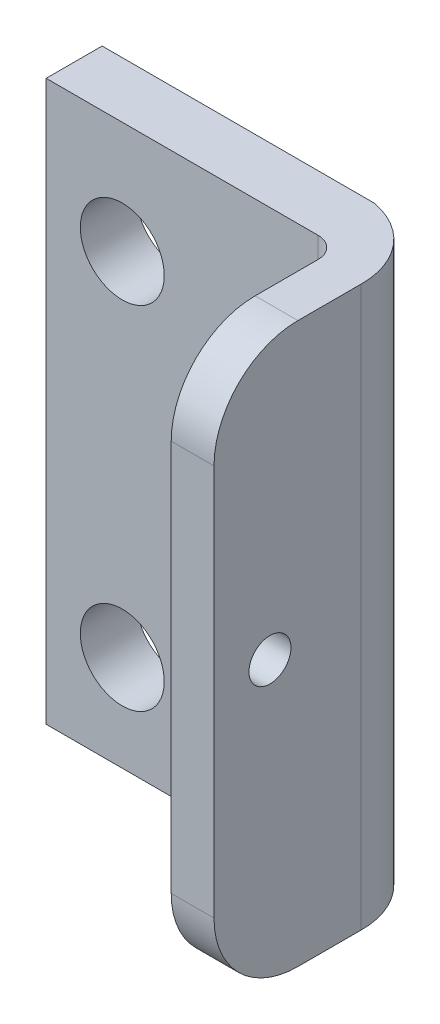
ISO-10303-21;
HEADER;
FILE_DESCRIPTION(('STEP AP214'),'2;1');
FILE_NAME('part.step','',(''),(''),'','','');
FILE_SCHEMA(('AUTOMOTIVE_DESIGN { 1 0 10303 214 1 1 1 1 }'));
ENDSEC;
DATA;
#1=APPLICATION_CONTEXT('core data for automotive mechanical design processes');
#2=APPLICATION_PROTOCOL_DEFINITION('international standard','automotive_design',2000,#1);
#3=PRODUCT_CONTEXT('',#1,'mechanical');
#4=PRODUCT('Part','Part','',(#3));
#5=PRODUCT_RELATED_PRODUCT_CATEGORY('part','',(#4));
#6=PRODUCT_DEFINITION_FORMATION('','',#4);
#7=PRODUCT_DEFINITION_CONTEXT('part definition',#1,'design');
#8=PRODUCT_DEFINITION('design','',#6,#7);
#9=PRODUCT_DEFINITION_SHAPE('','',#8);
#10=(LENGTH_UNIT() NAMED_UNIT(*) SI_UNIT(.MILLI.,.METRE.));
#11=(NAMED_UNIT(*) PLANE_ANGLE_UNIT() SI_UNIT($,.RADIAN.));
#12=(NAMED_UNIT(*) SI_UNIT($,.STERADIAN.) SOLID_ANGLE_UNIT());
#13=UNCERTAINTY_MEASURE_WITH_UNIT(LENGTH_MEASURE(1.E-05),#10,'distance_accuracy_value','');
#14=(GEOMETRIC_REPRESENTATION_CONTEXT(3) GLOBAL_UNCERTAINTY_ASSIGNED_CONTEXT((#13)) GLOBAL_UNIT_ASSIGNED_CONTEXT((#10,
#11,#12)) REPRESENTATION_CONTEXT('',''));
#15=CARTESIAN_POINT('',(0.,0.,0.));
#16=DIRECTION('',(0.,0.,1.));
#17=DIRECTION('',(1.,0.,0.));
#18=AXIS2_PLACEMENT_3D('',#15,#16,#17);
#19=CARTESIAN_POINT('',(0.,0.,2.));
#20=DIRECTION('',(0.,0.,-1.));
#21=DIRECTION('',(-1.,0.,0.));
#22=AXIS2_PLACEMENT_3D('',#19,#20,#21);
#23=PLANE('',#22);
#24=DIRECTION('',(0.,-1.,0.));
#25=VECTOR('',#24,1.);
#26=CARTESIAN_POINT('',(0.,0.,2.));
#27=LINE('',#26,#25);
#28=CARTESIAN_POINT('',(0.,20.,2.));
#29=VERTEX_POINT('',#28);
#30=CARTESIAN_POINT('',(0.,0.,2.));
#31=VERTEX_POINT('',#30);
#32=EDGE_CURVE('E79',#29,#31,#27,.T.);
#33=ORIENTED_EDGE('',*,*,#32,.T.);
#34=DIRECTION('',(1.,0.,0.));
#35=VECTOR('',#34,1.);
#36=CARTESIAN_POINT('',(0.,0.,2.));
#37=LINE('',#36,#35);
#38=CARTESIAN_POINT('',(9.72,0.,2.));
#39=VERTEX_POINT('',#38);
#40=EDGE_CURVE('E295',#31,#39,#37,.T.);
#41=ORIENTED_EDGE('',*,*,#40,.T.);
#42=DIRECTION('',(0.,1.,0.));
#43=VECTOR('',#42,1.);
#44=CARTESIAN_POINT('',(9.72,0.,2.));
#45=LINE('',#44,#43);
#46=CARTESIAN_POINT('',(9.72,20.,2.));
#47=VERTEX_POINT('',#46);
#48=EDGE_CURVE('E297',#39,#47,#45,.T.);
#49=ORIENTED_EDGE('',*,*,#48,.T.);
#50=DIRECTION('',(-1.,0.,0.));
#51=VECTOR('',#50,1.);
#52=CARTESIAN_POINT('',(0.,20.,2.));
#53=LINE('',#52,#51);
#54=EDGE_CURVE('E54',#47,#29,#53,.T.);
#55=ORIENTED_EDGE('',*,*,#54,.T.);
#56=EDGE_LOOP('',(#33,#41,#49,#55));
#57=FACE_BOUND('',#56,.T.);
#58=CARTESIAN_POINT('',(2.72,16.,2.));
#59=DIRECTION('',(0.,0.,1.));
#60=DIRECTION('',(1.,0.,0.));
#61=AXIS2_PLACEMENT_3D('',#58,#59,#60);
#62=CIRCLE('',#61,1.5);
#63=CARTESIAN_POINT('',(4.22,16.,2.));
#64=VERTEX_POINT('',#63);
#65=EDGE_CURVE('E91',#64,#64,#62,.T.);
#66=ORIENTED_EDGE('',*,*,#65,.F.);
#67=EDGE_LOOP('',(#66));
#68=FACE_BOUND('',#67,.T.);
#69=CARTESIAN_POINT('',(2.72,3.43,2.));
#70=DIRECTION('',(0.,0.,1.));
#71=DIRECTION('',(1.,0.,0.));
#72=AXIS2_PLACEMENT_3D('',#69,#70,#71);
#73=CIRCLE('',#72,1.5);
#74=CARTESIAN_POINT('',(4.22,3.43,2.));
#75=VERTEX_POINT('',#74);
#76=EDGE_CURVE('E287',#75,#75,#73,.T.);
#77=ORIENTED_EDGE('',*,*,#76,.F.);
#78=EDGE_LOOP('',(#77));
#79=FACE_BOUND('',#78,.T.);
#80=ADVANCED_FACE('F35',(#57,#68,#79),#23,.F.);
#81=CARTESIAN_POINT('',(0.,0.,0.));
#82=DIRECTION('',(0.,0.,-1.));
#83=DIRECTION('',(-1.,0.,0.));
#84=AXIS2_PLACEMENT_3D('',#81,#82,#83);
#85=PLANE('',#84);
#86=CARTESIAN_POINT('',(2.72,16.,0.));
#87=DIRECTION('',(0.,0.,1.));
#88=DIRECTION('',(1.,0.,0.));
#89=AXIS2_PLACEMENT_3D('',#86,#87,#88);
#90=CIRCLE('',#89,1.5);
#91=CARTESIAN_POINT('',(4.22,16.,0.));
#92=VERTEX_POINT('',#91);
#93=EDGE_CURVE('E95',#92,#92,#90,.T.);
#94=ORIENTED_EDGE('',*,*,#93,.T.);
#95=EDGE_LOOP('',(#94));
#96=FACE_BOUND('',#95,.T.);
#97=DIRECTION('',(0.,-1.,0.));
#98=VECTOR('',#97,1.);
#99=CARTESIAN_POINT('',(0.,0.,0.));
#100=LINE('',#99,#98);
#101=CARTESIAN_POINT('',(0.,20.,0.));
#102=VERTEX_POINT('',#101);
#103=CARTESIAN_POINT('',(0.,0.,0.));
#104=VERTEX_POINT('',#103);
#105=EDGE_CURVE('E85',#102,#104,#100,.T.);
#106=ORIENTED_EDGE('',*,*,#105,.F.);
#107=DIRECTION('',(-1.,0.,0.));
#108=VECTOR('',#107,1.);
#109=CARTESIAN_POINT('',(0.,20.,0.));
#110=LINE('',#109,#108);
#111=CARTESIAN_POINT('',(9.72,20.,0.));
#112=VERTEX_POINT('',#111);
#113=EDGE_CURVE('E72',#112,#102,#110,.T.);
#114=ORIENTED_EDGE('',*,*,#113,.F.);
#115=DIRECTION('',(0.,1.,0.));
#116=VECTOR('',#115,1.);
#117=CARTESIAN_POINT('',(9.72,20.,0.));
#118=LINE('',#117,#116);
#119=CARTESIAN_POINT('',(9.72,0.,0.));
#120=VERTEX_POINT('',#119);
#121=EDGE_CURVE('E80',#120,#112,#118,.T.);
#122=ORIENTED_EDGE('',*,*,#121,.F.);
#123=DIRECTION('',(1.,0.,0.));
#124=VECTOR('',#123,1.);
#125=CARTESIAN_POINT('',(0.,0.,0.));
#126=LINE('',#125,#124);
#127=EDGE_CURVE('E90',#104,#120,#126,.T.);
#128=ORIENTED_EDGE('',*,*,#127,.F.);
#129=EDGE_LOOP('',(#106,#114,#122,#128));
#130=FACE_BOUND('',#129,.T.);
#131=CARTESIAN_POINT('',(2.72,3.43,0.));
#132=DIRECTION('',(0.,0.,1.));
#133=DIRECTION('',(1.,0.,0.));
#134=AXIS2_PLACEMENT_3D('',#131,#132,#133);
#135=CIRCLE('',#134,1.5);
#136=CARTESIAN_POINT('',(4.22,3.43,0.));
#137=VERTEX_POINT('',#136);
#138=EDGE_CURVE('E286',#137,#137,#135,.T.);
#139=ORIENTED_EDGE('',*,*,#138,.T.);
#140=EDGE_LOOP('',(#139));
#141=FACE_BOUND('',#140,.T.);
#142=ADVANCED_FACE('F87',(#96,#130,#141),#85,.T.);
#143=CARTESIAN_POINT('',(0.,0.,2.));
#144=DIRECTION('',(1.,0.,0.));
#145=DIRECTION('',(0.,0.,-1.));
#146=AXIS2_PLACEMENT_3D('',#143,#144,#145);
#147=PLANE('',#146);
#148=ORIENTED_EDGE('',*,*,#105,.T.);
#149=DIRECTION('',(0.,0.,-1.));
#150=VECTOR('',#149,1.);
#151=CARTESIAN_POINT('',(0.,0.,2.));
#152=LINE('',#151,#150);
#153=EDGE_CURVE('E11',#31,#104,#152,.T.);
#154=ORIENTED_EDGE('',*,*,#153,.F.);
#155=ORIENTED_EDGE('',*,*,#32,.F.);
#156=DIRECTION('',(0.,0.,-1.));
#157=VECTOR('',#156,1.);
#158=CARTESIAN_POINT('',(0.,20.,2.));
#159=LINE('',#158,#157);
#160=EDGE_CURVE('E45',#29,#102,#159,.T.);
#161=ORIENTED_EDGE('',*,*,#160,.T.);
#162=EDGE_LOOP('',(#148,#154,#155,#161));
#163=FACE_BOUND('',#162,.T.);
#164=ADVANCED_FACE('F37',(#163),#147,.F.);
#165=CARTESIAN_POINT('',(0.,0.,2.));
#166=DIRECTION('',(0.,1.,0.));
#167=DIRECTION('',(0.,0.,1.));
#168=AXIS2_PLACEMENT_3D('',#165,#166,#167);
#169=PLANE('',#168);
#170=ORIENTED_EDGE('',*,*,#127,.T.);
#171=CARTESIAN_POINT('',(9.25,0.,2.70953870612693));
#172=DIRECTION('',(0.,-1.,0.));
#173=DIRECTION('',(0.,0.,-1.));
#174=AXIS2_PLACEMENT_3D('',#171,#172,#173);
#175=CIRCLE('',#174,2.75);
#176=CARTESIAN_POINT('',(11.9998511631899,0.,2.75));
#177=VERTEX_POINT('',#176);
#178=EDGE_CURVE('E153',#120,#177,#175,.T.);
#179=ORIENTED_EDGE('',*,*,#178,.T.);
#180=DIRECTION('',(0.,0.,-1.));
#181=VECTOR('',#180,1.);
#182=CARTESIAN_POINT('',(12.,0.,4.99999999999998));
#183=LINE('',#182,#181);
#184=CARTESIAN_POINT('',(12.,0.,4.99999999999998));
#185=VERTEX_POINT('',#184);
#186=EDGE_CURVE('E218',#185,#177,#183,.T.);
#187=ORIENTED_EDGE('',*,*,#186,.F.);
#188=DIRECTION('',(1.,0.,0.));
#189=VECTOR('',#188,1.);
#190=CARTESIAN_POINT('',(10.47,0.,4.99999999999998));
#191=LINE('',#190,#189);
#192=CARTESIAN_POINT('',(10.47,0.,4.99999999999998));
#193=VERTEX_POINT('',#192);
#194=EDGE_CURVE('E239',#193,#185,#191,.T.);
#195=ORIENTED_EDGE('',*,*,#194,.F.);
#196=DIRECTION('',(0.,0.,-1.));
#197=VECTOR('',#196,1.);
#198=CARTESIAN_POINT('',(10.47,0.,4.99999999999998));
#199=LINE('',#198,#197);
#200=CARTESIAN_POINT('',(10.47,0.,2.75));
#201=VERTEX_POINT('',#200);
#202=EDGE_CURVE('E204',#193,#201,#199,.T.);
#203=ORIENTED_EDGE('',*,*,#202,.T.);
#204=CARTESIAN_POINT('',(9.72,0.,2.75));
#205=DIRECTION('',(0.,1.,0.));
#206=DIRECTION('',(0.,0.,-1.));
#207=AXIS2_PLACEMENT_3D('',#204,#205,#206);
#208=CIRCLE('',#207,0.75);
#209=EDGE_CURVE('E241',#201,#39,#208,.T.);
#210=ORIENTED_EDGE('',*,*,#209,.T.);
#211=ORIENTED_EDGE('',*,*,#40,.F.);
#212=ORIENTED_EDGE('',*,*,#153,.T.);
#213=EDGE_LOOP('',(#170,#179,#187,#195,#203,#210,#211,#212));
#214=FACE_BOUND('',#213,.T.);
#215=ADVANCED_FACE('F145',(#214),#169,.F.);
#216=CARTESIAN_POINT('',(0.,20.,2.));
#217=DIRECTION('',(0.,-1.,0.));
#218=DIRECTION('',(0.,0.,-1.));
#219=AXIS2_PLACEMENT_3D('',#216,#217,#218);
#220=PLANE('',#219);
#221=ORIENTED_EDGE('',*,*,#113,.T.);
#222=ORIENTED_EDGE('',*,*,#160,.F.);
#223=ORIENTED_EDGE('',*,*,#54,.F.);
#224=CARTESIAN_POINT('',(9.72,20.,2.75));
#225=DIRECTION('',(0.,1.,0.));
#226=DIRECTION('',(0.,0.,-1.));
#227=AXIS2_PLACEMENT_3D('',#224,#225,#226);
#228=CIRCLE('',#227,0.75);
#229=CARTESIAN_POINT('',(10.47,20.,2.75));
#230=VERTEX_POINT('',#229);
#231=EDGE_CURVE('E217',#230,#47,#228,.T.);
#232=ORIENTED_EDGE('',*,*,#231,.F.);
#233=DIRECTION('',(0.,0.,1.));
#234=VECTOR('',#233,1.);
#235=CARTESIAN_POINT('',(10.47,20.,2.75));
#236=LINE('',#235,#234);
#237=CARTESIAN_POINT('',(10.47,20.,4.99999999999998));
#238=VERTEX_POINT('',#237);
#239=EDGE_CURVE('E211',#230,#238,#236,.T.);
#240=ORIENTED_EDGE('',*,*,#239,.T.);
#241=DIRECTION('',(1.,0.,0.));
#242=VECTOR('',#241,1.);
#243=CARTESIAN_POINT('',(10.47,20.,4.99999999999998));
#244=LINE('',#243,#242);
#245=CARTESIAN_POINT('',(12.,20.,4.99999999999998));
#246=VERTEX_POINT('',#245);
#247=EDGE_CURVE('E196',#238,#246,#244,.T.);
#248=ORIENTED_EDGE('',*,*,#247,.T.);
#249=DIRECTION('',(0.,0.,1.));
#250=VECTOR('',#249,1.);
#251=CARTESIAN_POINT('',(12.,20.,2.75));
#252=LINE('',#251,#250);
#253=CARTESIAN_POINT('',(11.9998511631899,20.,2.75));
#254=VERTEX_POINT('',#253);
#255=EDGE_CURVE('E234',#254,#246,#252,.T.);
#256=ORIENTED_EDGE('',*,*,#255,.F.);
#257=CARTESIAN_POINT('',(9.25,20.,2.70953870612693));
#258=DIRECTION('',(0.,-1.,0.));
#259=DIRECTION('',(0.,0.,-1.));
#260=AXIS2_PLACEMENT_3D('',#257,#258,#259);
#261=CIRCLE('',#260,2.75);
#262=EDGE_CURVE('E69',#112,#254,#261,.T.);
#263=ORIENTED_EDGE('',*,*,#262,.F.);
#264=EDGE_LOOP('',(#221,#222,#223,#232,#240,#248,#256,#263));
#265=FACE_BOUND('',#264,.T.);
#266=ADVANCED_FACE('F74',(#265),#220,.F.);
#267=CARTESIAN_POINT('',(2.72,16.,2.));
#268=DIRECTION('',(0.,0.,-1.));
#269=DIRECTION('',(-1.,0.,0.));
#270=AXIS2_PLACEMENT_3D('',#267,#268,#269);
#271=CYLINDRICAL_SURFACE('',#270,1.5);
#272=ORIENTED_EDGE('',*,*,#65,.T.);
#273=EDGE_LOOP('',(#272));
#274=FACE_BOUND('',#273,.T.);
#275=ORIENTED_EDGE('',*,*,#93,.F.);
#276=EDGE_LOOP('',(#275));
#277=FACE_BOUND('',#276,.T.);
#278=ADVANCED_FACE('F134',(#274,#277),#271,.F.);
#279=CARTESIAN_POINT('',(2.72,3.43,2.));
#280=DIRECTION('',(0.,0.,-1.));
#281=DIRECTION('',(-1.,0.,0.));
#282=AXIS2_PLACEMENT_3D('',#279,#280,#281);
#283=CYLINDRICAL_SURFACE('',#282,1.5);
#284=ORIENTED_EDGE('',*,*,#76,.T.);
#285=EDGE_LOOP('',(#284));
#286=FACE_BOUND('',#285,.T.);
#287=ORIENTED_EDGE('',*,*,#138,.F.);
#288=EDGE_LOOP('',(#287));
#289=FACE_BOUND('',#288,.T.);
#290=ADVANCED_FACE('F130',(#286,#289),#283,.F.);
#291=CARTESIAN_POINT('',(9.72,20.,2.75));
#292=DIRECTION('',(0.,-1.,0.));
#293=DIRECTION('',(0.,0.,-1.));
#294=AXIS2_PLACEMENT_3D('',#291,#292,#293);
#295=CYLINDRICAL_SURFACE('',#294,0.75);
#296=ORIENTED_EDGE('',*,*,#209,.F.);
#297=DIRECTION('',(0.,-1.,0.));
#298=VECTOR('',#297,1.);
#299=CARTESIAN_POINT('',(10.47,20.,2.75));
#300=LINE('',#299,#298);
#301=EDGE_CURVE('E284',#230,#201,#300,.T.);
#302=ORIENTED_EDGE('',*,*,#301,.F.);
#303=ORIENTED_EDGE('',*,*,#231,.T.);
#304=ORIENTED_EDGE('',*,*,#48,.F.);
#305=EDGE_LOOP('',(#296,#302,#303,#304));
#306=FACE_BOUND('',#305,.T.);
#307=ADVANCED_FACE('F125',(#306),#295,.F.);
#308=CARTESIAN_POINT('',(9.25,20.,2.70953870612693));
#309=DIRECTION('',(0.,-1.,0.));
#310=DIRECTION('',(0.,0.,-1.));
#311=AXIS2_PLACEMENT_3D('',#308,#309,#310);
#312=CYLINDRICAL_SURFACE('',#311,2.75);
#313=ORIENTED_EDGE('',*,*,#178,.F.);
#314=ORIENTED_EDGE('',*,*,#121,.T.);
#315=ORIENTED_EDGE('',*,*,#262,.T.);
#316=CARTESIAN_POINT('',(11.9997023263797,20.,2.75));
#317=DIRECTION('',(0.,-1.,0.));
#318=VECTOR('',#317,1.);
#319=LINE('',#316,#318);
#320=EDGE_CURVE('E107',#254,#177,#319,.T.);
#321=ORIENTED_EDGE('',*,*,#320,.T.);
#322=EDGE_LOOP('',(#313,#314,#315,#321));
#323=FACE_BOUND('',#322,.T.);
#324=ADVANCED_FACE('F114',(#323),#312,.T.);
#325=CARTESIAN_POINT('',(10.47,3.,5.));
#326=DIRECTION('',(1.,0.,0.));
#327=DIRECTION('',(0.,0.,-1.));
#328=AXIS2_PLACEMENT_3D('',#325,#326,#327);
#329=CYLINDRICAL_SURFACE('',#328,3.);
#330=CARTESIAN_POINT('',(12.,3.,5.));
#331=DIRECTION('',(1.,0.,0.));
#332=DIRECTION('',(0.,0.,-1.));
#333=AXIS2_PLACEMENT_3D('',#330,#331,#332);
#334=CIRCLE('',#333,3.);
#335=CARTESIAN_POINT('',(12.,3.00000000000002,8.));
#336=VERTEX_POINT('',#335);
#337=EDGE_CURVE('E220',#336,#185,#334,.T.);
#338=ORIENTED_EDGE('',*,*,#337,.F.);
#339=DIRECTION('',(1.,0.,0.));
#340=VECTOR('',#339,1.);
#341=CARTESIAN_POINT('',(10.47,3.00000000000002,8.));
#342=LINE('',#341,#340);
#343=CARTESIAN_POINT('',(10.47,3.00000000000002,8.));
#344=VERTEX_POINT('',#343);
#345=EDGE_CURVE('E242',#344,#336,#342,.T.);
#346=ORIENTED_EDGE('',*,*,#345,.F.);
#347=CARTESIAN_POINT('',(10.47,3.,5.));
#348=DIRECTION('',(1.,0.,0.));
#349=DIRECTION('',(0.,0.,-1.));
#350=AXIS2_PLACEMENT_3D('',#347,#348,#349);
#351=CIRCLE('',#350,3.);
#352=EDGE_CURVE('E227',#344,#193,#351,.T.);
#353=ORIENTED_EDGE('',*,*,#352,.T.);
#354=ORIENTED_EDGE('',*,*,#194,.T.);
#355=EDGE_LOOP('',(#338,#346,#353,#354));
#356=FACE_BOUND('',#355,.T.);
#357=ADVANCED_FACE('F124',(#356),#329,.T.);
#358=CARTESIAN_POINT('',(10.47,17.,8.));
#359=DIRECTION('',(0.,0.,1.));
#360=DIRECTION('',(0.,-1.,0.));
#361=AXIS2_PLACEMENT_3D('',#358,#359,#360);
#362=PLANE('',#361);
#363=DIRECTION('',(0.,-1.,0.));
#364=VECTOR('',#363,1.);
#365=CARTESIAN_POINT('',(12.,17.,8.));
#366=LINE('',#365,#364);
#367=CARTESIAN_POINT('',(12.,17.,8.));
#368=VERTEX_POINT('',#367);
#369=EDGE_CURVE('E233',#368,#336,#366,.T.);
#370=ORIENTED_EDGE('',*,*,#369,.F.);
#371=DIRECTION('',(1.,0.,0.));
#372=VECTOR('',#371,1.);
#373=CARTESIAN_POINT('',(10.47,17.,8.));
#374=LINE('',#373,#372);
#375=CARTESIAN_POINT('',(10.47,17.,8.));
#376=VERTEX_POINT('',#375);
#377=EDGE_CURVE('E203',#376,#368,#374,.T.);
#378=ORIENTED_EDGE('',*,*,#377,.F.);
#379=DIRECTION('',(0.,-1.,0.));
#380=VECTOR('',#379,1.);
#381=CARTESIAN_POINT('',(10.47,17.,8.));
#382=LINE('',#381,#380);
#383=EDGE_CURVE('E214',#376,#344,#382,.T.);
#384=ORIENTED_EDGE('',*,*,#383,.T.);
#385=ORIENTED_EDGE('',*,*,#345,.T.);
#386=EDGE_LOOP('',(#370,#378,#384,#385));
#387=FACE_BOUND('',#386,.T.);
#388=ADVANCED_FACE('F265',(#387),#362,.T.);
#389=CARTESIAN_POINT('',(10.47,17.,5.));
#390=DIRECTION('',(1.,0.,0.));
#391=DIRECTION('',(0.,0.,-1.));
#392=AXIS2_PLACEMENT_3D('',#389,#390,#391);
#393=CYLINDRICAL_SURFACE('',#392,3.);
#394=CARTESIAN_POINT('',(12.,17.,5.));
#395=DIRECTION('',(1.,0.,0.));
#396=DIRECTION('',(0.,0.,-1.));
#397=AXIS2_PLACEMENT_3D('',#394,#395,#396);
#398=CIRCLE('',#397,3.);
#399=EDGE_CURVE('E200',#246,#368,#398,.T.);
#400=ORIENTED_EDGE('',*,*,#399,.F.);
#401=ORIENTED_EDGE('',*,*,#247,.F.);
#402=CARTESIAN_POINT('',(10.47,17.,5.));
#403=DIRECTION('',(1.,0.,0.));
#404=DIRECTION('',(0.,0.,-1.));
#405=AXIS2_PLACEMENT_3D('',#402,#403,#404);
#406=CIRCLE('',#405,3.);
#407=EDGE_CURVE('E198',#238,#376,#406,.T.);
#408=ORIENTED_EDGE('',*,*,#407,.T.);
#409=ORIENTED_EDGE('',*,*,#377,.T.);
#410=EDGE_LOOP('',(#400,#401,#408,#409));
#411=FACE_BOUND('',#410,.T.);
#412=ADVANCED_FACE('F126',(#411),#393,.T.);
#413=CARTESIAN_POINT('',(10.47,3.,5.));
#414=DIRECTION('',(1.,0.,0.));
#415=DIRECTION('',(0.,0.,-1.));
#416=AXIS2_PLACEMENT_3D('',#413,#414,#415);
#417=PLANE('',#416);
#418=CARTESIAN_POINT('',(10.47,10.,6.));
#419=DIRECTION('',(1.,0.,0.));
#420=DIRECTION('',(0.,0.,-1.));
#421=AXIS2_PLACEMENT_3D('',#418,#419,#420);
#422=CIRCLE('',#421,0.750000000000001);
#423=CARTESIAN_POINT('',(10.47,10.,5.25));
#424=VERTEX_POINT('',#423);
#425=EDGE_CURVE('E274',#424,#424,#422,.T.);
#426=ORIENTED_EDGE('',*,*,#425,.T.);
#427=EDGE_LOOP('',(#426));
#428=FACE_BOUND('',#427,.T.);
#429=ORIENTED_EDGE('',*,*,#301,.T.);
#430=ORIENTED_EDGE('',*,*,#202,.F.);
#431=ORIENTED_EDGE('',*,*,#352,.F.);
#432=ORIENTED_EDGE('',*,*,#383,.F.);
#433=ORIENTED_EDGE('',*,*,#407,.F.);
#434=ORIENTED_EDGE('',*,*,#239,.F.);
#435=EDGE_LOOP('',(#429,#430,#431,#432,#433,#434));
#436=FACE_BOUND('',#435,.T.);
#437=ADVANCED_FACE('F210',(#428,#436),#417,.F.);
#438=CARTESIAN_POINT('',(12.,3.,5.));
#439=DIRECTION('',(1.,0.,0.));
#440=DIRECTION('',(0.,0.,-1.));
#441=AXIS2_PLACEMENT_3D('',#438,#439,#440);
#442=PLANE('',#441);
#443=CARTESIAN_POINT('',(12.,10.,6.));
#444=DIRECTION('',(1.,0.,0.));
#445=DIRECTION('',(0.,0.,-1.));
#446=AXIS2_PLACEMENT_3D('',#443,#444,#445);
#447=CIRCLE('',#446,0.750000000000001);
#448=CARTESIAN_POINT('',(12.,10.,5.25));
#449=VERTEX_POINT('',#448);
#450=EDGE_CURVE('E223',#449,#449,#447,.T.);
#451=ORIENTED_EDGE('',*,*,#450,.F.);
#452=EDGE_LOOP('',(#451));
#453=FACE_BOUND('',#452,.T.);
#454=ORIENTED_EDGE('',*,*,#320,.F.);
#455=ORIENTED_EDGE('',*,*,#255,.T.);
#456=ORIENTED_EDGE('',*,*,#399,.T.);
#457=ORIENTED_EDGE('',*,*,#369,.T.);
#458=ORIENTED_EDGE('',*,*,#337,.T.);
#459=ORIENTED_EDGE('',*,*,#186,.T.);
#460=EDGE_LOOP('',(#454,#455,#456,#457,#458,#459));
#461=FACE_BOUND('',#460,.T.);
#462=ADVANCED_FACE('F251',(#453,#461),#442,.T.);
#463=CARTESIAN_POINT('',(10.47,10.,6.));
#464=DIRECTION('',(1.,0.,0.));
#465=DIRECTION('',(0.,0.,-1.));
#466=AXIS2_PLACEMENT_3D('',#463,#464,#465);
#467=CYLINDRICAL_SURFACE('',#466,0.750000000000001);
#468=ORIENTED_EDGE('',*,*,#425,.F.);
#469=EDGE_LOOP('',(#468));
#470=FACE_BOUND('',#469,.T.);
#471=ORIENTED_EDGE('',*,*,#450,.T.);
#472=EDGE_LOOP('',(#471));
#473=FACE_BOUND('',#472,.T.);
#474=ADVANCED_FACE('F261',(#470,#473),#467,.F.);
#475=CLOSED_SHELL('',(#80,#142,#164,#215,#266,#278,#290,#307,#324,#357,#388,#412,#437,#462,#474));
#476=MANIFOLD_SOLID_BREP('B2',#475);
#477=ADVANCED_BREP_SHAPE_REPRESENTATION('',(#18,#476),#14);
#478=SHAPE_DEFINITION_REPRESENTATION(#9,#477);
ENDSEC;
END-ISO-10303-21;
